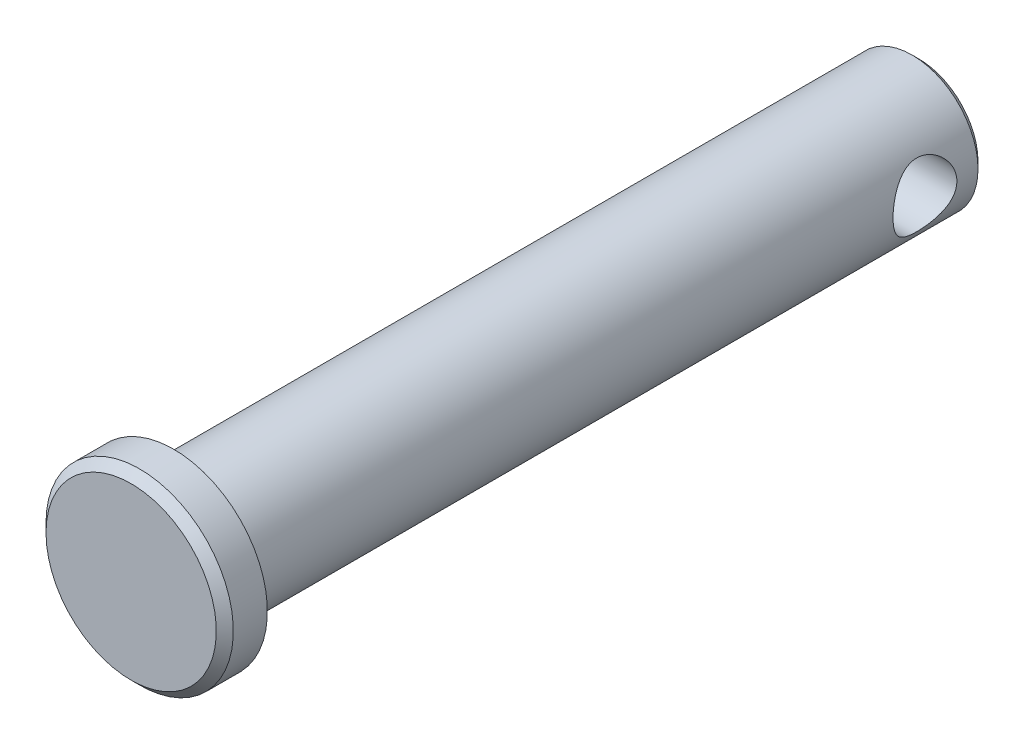
ISO-10303-21;
HEADER;
FILE_DESCRIPTION(('STEP AP214'),'2;1');
FILE_NAME('part.step','',(''),(''),'','','');
FILE_SCHEMA(('AUTOMOTIVE_DESIGN { 1 0 10303 214 1 1 1 1 }'));
ENDSEC;
DATA;
#1=APPLICATION_CONTEXT('core data for automotive mechanical design processes');
#2=APPLICATION_PROTOCOL_DEFINITION('international standard','automotive_design',2000,#1);
#3=PRODUCT_CONTEXT('',#1,'mechanical');
#4=PRODUCT('Part','Part','',(#3));
#5=PRODUCT_RELATED_PRODUCT_CATEGORY('part','',(#4));
#6=PRODUCT_DEFINITION_FORMATION('','',#4);
#7=PRODUCT_DEFINITION_CONTEXT('part definition',#1,'design');
#8=PRODUCT_DEFINITION('design','',#6,#7);
#9=PRODUCT_DEFINITION_SHAPE('','',#8);
#10=(LENGTH_UNIT() NAMED_UNIT(*) SI_UNIT(.MILLI.,.METRE.));
#11=(NAMED_UNIT(*) PLANE_ANGLE_UNIT() SI_UNIT($,.RADIAN.));
#12=(NAMED_UNIT(*) SI_UNIT($,.STERADIAN.) SOLID_ANGLE_UNIT());
#13=UNCERTAINTY_MEASURE_WITH_UNIT(LENGTH_MEASURE(1.E-05),#10,'distance_accuracy_value','');
#14=(GEOMETRIC_REPRESENTATION_CONTEXT(3) GLOBAL_UNCERTAINTY_ASSIGNED_CONTEXT((#13)) GLOBAL_UNIT_ASSIGNED_CONTEXT((#10,
#11,#12)) REPRESENTATION_CONTEXT('',''));
#15=CARTESIAN_POINT('',(0.,0.,0.));
#16=DIRECTION('',(0.,0.,1.));
#17=DIRECTION('',(1.,0.,0.));
#18=AXIS2_PLACEMENT_3D('',#15,#16,#17);
#19=CARTESIAN_POINT('',(0.,0.,24.765));
#20=DIRECTION('',(0.,0.,1.));
#21=DIRECTION('',(1.,0.,0.));
#22=AXIS2_PLACEMENT_3D('',#19,#20,#21);
#23=PLANE('',#22);
#24=CARTESIAN_POINT('',(0.,0.,24.7650000000021));
#25=DIRECTION('',(0.,0.,-1.));
#26=DIRECTION('',(-1.,0.,0.));
#27=AXIS2_PLACEMENT_3D('',#24,#25,#26);
#28=CIRCLE('',#27,5.08000000002085);
#29=CARTESIAN_POINT('',(-5.08000000002085,0.,24.7650000000021));
#30=VERTEX_POINT('',#29);
#31=EDGE_CURVE('E25',#30,#30,#28,.T.);
#32=ORIENTED_EDGE('',*,*,#31,.F.);
#33=EDGE_LOOP('',(#32));
#34=FACE_BOUND('',#33,.T.);
#35=ADVANCED_FACE('F22',(#34),#23,.T.);
#36=CARTESIAN_POINT('',(0.,0.,24.257000000091));
#37=DIRECTION('',(0.,0.,-1.));
#38=DIRECTION('',(-1.,0.,0.));
#39=AXIS2_PLACEMENT_3D('',#36,#37,#38);
#40=CONICAL_SURFACE('',#39,5.58799999993198,0.785398163397448);
#41=ORIENTED_EDGE('',*,*,#31,.T.);
#42=EDGE_LOOP('',(#41));
#43=FACE_BOUND('',#42,.T.);
#44=CARTESIAN_POINT('',(0.,0.,24.257));
#45=DIRECTION('',(0.,0.,-1.));
#46=DIRECTION('',(-1.,0.,0.));
#47=AXIS2_PLACEMENT_3D('',#44,#45,#46);
#48=CIRCLE('',#47,5.588);
#49=CARTESIAN_POINT('',(-5.588,0.,24.257));
#50=VERTEX_POINT('',#49);
#51=EDGE_CURVE('E47',#50,#50,#48,.T.);
#52=ORIENTED_EDGE('',*,*,#51,.F.);
#53=EDGE_LOOP('',(#52));
#54=FACE_BOUND('',#53,.T.);
#55=ADVANCED_FACE('F89',(#43,#54),#40,.T.);
#56=CARTESIAN_POINT('',(0.,0.,24.765));
#57=DIRECTION('',(0.,0.,-1.));
#58=DIRECTION('',(-1.,0.,0.));
#59=AXIS2_PLACEMENT_3D('',#56,#57,#58);
#60=CYLINDRICAL_SURFACE('',#59,5.588);
#61=ORIENTED_EDGE('',*,*,#51,.T.);
#62=EDGE_LOOP('',(#61));
#63=FACE_BOUND('',#62,.T.);
#64=CARTESIAN_POINT('',(0.,0.,22.225));
#65=DIRECTION('',(0.,0.,-1.));
#66=DIRECTION('',(-1.,0.,0.));
#67=AXIS2_PLACEMENT_3D('',#64,#65,#66);
#68=CIRCLE('',#67,5.588);
#69=CARTESIAN_POINT('',(-5.588,0.,22.225));
#70=VERTEX_POINT('',#69);
#71=EDGE_CURVE('E78',#70,#70,#68,.F.);
#72=ORIENTED_EDGE('',*,*,#71,.T.);
#73=EDGE_LOOP('',(#72));
#74=FACE_BOUND('',#73,.T.);
#75=ADVANCED_FACE('F96',(#63,#74),#60,.T.);
#76=CARTESIAN_POINT('',(0.,0.,-22.225));
#77=DIRECTION('',(0.,0.,1.));
#78=DIRECTION('',(1.,0.,0.));
#79=AXIS2_PLACEMENT_3D('',#76,#77,#78);
#80=PLANE('',#79);
#81=CARTESIAN_POINT('',(0.,0.,-22.2249999999917));
#82=DIRECTION('',(0.,0.,1.));
#83=DIRECTION('',(1.,0.,0.));
#84=AXIS2_PLACEMENT_3D('',#81,#82,#83);
#85=CIRCLE('',#84,3.53186999996069);
#86=CARTESIAN_POINT('',(3.53186999996069,0.,-22.2249999999917));
#87=VERTEX_POINT('',#86);
#88=EDGE_CURVE('E75',#87,#87,#85,.T.);
#89=ORIENTED_EDGE('',*,*,#88,.F.);
#90=EDGE_LOOP('',(#89));
#91=FACE_BOUND('',#90,.T.);
#92=ADVANCED_FACE('F100',(#91),#80,.F.);
#93=CARTESIAN_POINT('',(0.,0.,22.225));
#94=DIRECTION('',(0.,0.,1.));
#95=DIRECTION('',(1.,0.,0.));
#96=AXIS2_PLACEMENT_3D('',#93,#94,#95);
#97=PLANE('',#96);
#98=ORIENTED_EDGE('',*,*,#71,.F.);
#99=EDGE_LOOP('',(#98));
#100=FACE_BOUND('',#99,.T.);
#101=CARTESIAN_POINT('',(0.,0.,22.225));
#102=DIRECTION('',(0.,0.,-1.));
#103=DIRECTION('',(-1.,0.,0.));
#104=AXIS2_PLACEMENT_3D('',#101,#102,#103);
#105=CIRCLE('',#104,3.9243);
#106=CARTESIAN_POINT('',(-3.9243,0.,22.225));
#107=VERTEX_POINT('',#106);
#108=EDGE_CURVE('E73',#107,#107,#105,.T.);
#109=ORIENTED_EDGE('',*,*,#108,.F.);
#110=EDGE_LOOP('',(#109));
#111=FACE_BOUND('',#110,.T.);
#112=ADVANCED_FACE('F105',(#100,#111),#97,.F.);
#113=CARTESIAN_POINT('',(0.,0.,-21.832570000015));
#114=DIRECTION('',(0.,0.,1.));
#115=DIRECTION('',(1.,0.,0.));
#116=AXIS2_PLACEMENT_3D('',#113,#114,#115);
#117=CONICAL_SURFACE('',#116,3.92429999999422,0.785398163469873);
#118=CARTESIAN_POINT('',(0.,0.,-21.83257));
#119=DIRECTION('',(0.,0.,-1.));
#120=DIRECTION('',(-1.,0.,0.));
#121=AXIS2_PLACEMENT_3D('',#118,#119,#120);
#122=CIRCLE('',#121,3.9243);
#123=CARTESIAN_POINT('',(-3.9243,0.,-21.83257));
#124=VERTEX_POINT('',#123);
#125=EDGE_CURVE('E30',#124,#124,#122,.F.);
#126=ORIENTED_EDGE('',*,*,#125,.F.);
#127=EDGE_LOOP('',(#126));
#128=FACE_BOUND('',#127,.T.);
#129=ORIENTED_EDGE('',*,*,#88,.T.);
#130=EDGE_LOOP('',(#129));
#131=FACE_BOUND('',#130,.T.);
#132=ADVANCED_FACE('F64',(#128,#131),#117,.T.);
#133=CARTESIAN_POINT('',(-5.588,0.,-18.669));
#134=DIRECTION('',(1.,0.,0.));
#135=DIRECTION('',(0.,0.,-1.));
#136=AXIS2_PLACEMENT_3D('',#133,#134,#135);
#137=CYLINDRICAL_SURFACE('',#136,1.905);
#138=CARTESIAN_POINT('',(3.9243,0.,-20.574));
#139=CARTESIAN_POINT('',(3.92429536563109,-0.100584335974829,-20.5739946680779));
#140=CARTESIAN_POINT('',(3.92039402890045,-0.201230310135641,-20.5659932237658));
#141=CARTESIAN_POINT('',(3.90518183677525,-0.39950623478433,-20.5343485536885));
#142=CARTESIAN_POINT('',(3.89386299854148,-0.497132817078152,-20.5106884755675));
#143=CARTESIAN_POINT('',(3.86500502954331,-0.686289742951308,-20.4488596940996));
#144=CARTESIAN_POINT('',(3.84748727224581,-0.777839765922849,-20.410740811692));
#145=CARTESIAN_POINT('',(3.8078521242205,-0.95314281273583,-20.3213421740891));
#146=CARTESIAN_POINT('',(3.78573425912933,-1.03689503117681,-20.2700610614761));
#147=CARTESIAN_POINT('',(3.73745530838699,-1.19965669731222,-20.1524110825147));
#148=CARTESIAN_POINT('',(3.71113427603428,-1.27811084102049,-20.0853405975619));
#149=CARTESIAN_POINT('',(3.65796700961063,-1.42316075191727,-19.9395222187479));
#150=CARTESIAN_POINT('',(3.6311204365663,-1.48974856554055,-19.8607665570553));
#151=CARTESIAN_POINT('',(3.57772368622993,-1.6139767552182,-19.6869944059112));
#152=CARTESIAN_POINT('',(3.55133410246642,-1.67062736651559,-19.5912153112168));
#153=CARTESIAN_POINT('',(3.50449853546743,-1.76677684573332,-19.3900595621988));
#154=CARTESIAN_POINT('',(3.48404853033341,-1.80628732883054,-19.2846894660767));
#155=CARTESIAN_POINT('',(3.45320183728657,-1.86455473165811,-19.0736352976841));
#156=CARTESIAN_POINT('',(3.44228892940876,-1.88438648993204,-18.9683270457561));
#157=CARTESIAN_POINT('',(3.43035066451894,-1.90604184208311,-18.7553581892309));
#158=CARTESIAN_POINT('',(3.42931652887583,-1.9078814244873,-18.6476997583879));
#159=CARTESIAN_POINT('',(3.43683297751125,-1.894291555758,-18.4459291092597));
#160=CARTESIAN_POINT('',(3.44433144231032,-1.88075802691733,-18.3516407813914));
#161=CARTESIAN_POINT('',(3.46623657268144,-1.84007140869675,-18.1668909073699));
#162=CARTESIAN_POINT('',(3.4806452291913,-1.81291439406675,-18.0764304722736));
#163=CARTESIAN_POINT('',(3.51507406134726,-1.74523594343692,-17.8993392652997));
#164=CARTESIAN_POINT('',(3.53521725284567,-1.70441763982462,-17.8128469808758));
#165=CARTESIAN_POINT('',(3.57884350934135,-1.61079900902623,-17.6475378885952));
#166=CARTESIAN_POINT('',(3.60232798188494,-1.55799362655803,-17.5687243391728));
#167=CARTESIAN_POINT('',(3.65335932257068,-1.43459350622732,-17.4111732256991));
#168=CARTESIAN_POINT('',(3.68105779391882,-1.36263218058345,-17.3335515830275));
#169=CARTESIAN_POINT('',(3.73512991896394,-1.2065470233319,-17.1910131109213));
#170=CARTESIAN_POINT('',(3.76150273088281,-1.12241559209542,-17.12610428007));
#171=CARTESIAN_POINT('',(3.8112985188032,-0.939917490579675,-17.008319305737));
#172=CARTESIAN_POINT('',(3.8345513133014,-0.841101672049683,-16.9560622446721));
#173=CARTESIAN_POINT('',(3.87404331089877,-0.63473405841268,-16.8693875317563));
#174=CARTESIAN_POINT('',(3.89029598417956,-0.527199518900337,-16.834935592112));
#175=CARTESIAN_POINT('',(3.90936187014218,-0.348928405738588,-16.7949211341896));
#176=CARTESIAN_POINT('',(3.91493622025283,-0.279779800161764,-16.783352931244));
#177=CARTESIAN_POINT('',(3.92240676358096,-0.140430759474601,-16.7678907938009));
#178=CARTESIAN_POINT('',(3.92430323582793,-0.070230404564547,-16.7639962771236));
#179=CARTESIAN_POINT('',(3.92429536563109,0.100584335974829,-16.7640053319221));
#180=CARTESIAN_POINT('',(3.92039402890045,0.201230310135642,-16.7720067762342));
#181=CARTESIAN_POINT('',(3.90518183677525,0.399506234784331,-16.8036514463115));
#182=CARTESIAN_POINT('',(3.89386299854148,0.497132817078153,-16.8273115244325));
#183=CARTESIAN_POINT('',(3.86500502954331,0.686289742951309,-16.8891403059004));
#184=CARTESIAN_POINT('',(3.84748727224581,0.777839765922849,-16.927259188308));
#185=CARTESIAN_POINT('',(3.8078521242205,0.95314281273583,-17.0166578259109));
#186=CARTESIAN_POINT('',(3.78573425912933,1.03689503117681,-17.0679389385239));
#187=CARTESIAN_POINT('',(3.73745530838699,1.19965669731222,-17.1855889174853));
#188=CARTESIAN_POINT('',(3.71113427603428,1.27811084102049,-17.252659402438));
#189=CARTESIAN_POINT('',(3.65796700961063,1.42316075191727,-17.3984777812521));
#190=CARTESIAN_POINT('',(3.6311204365663,1.48974856554055,-17.4772334429447));
#191=CARTESIAN_POINT('',(3.57772368622993,1.6139767552182,-17.6510055940888));
#192=CARTESIAN_POINT('',(3.55133410246642,1.67062736651559,-17.7467846887832));
#193=CARTESIAN_POINT('',(3.50449853546743,1.76677684573332,-17.9479404378012));
#194=CARTESIAN_POINT('',(3.48404853033341,1.80628732883054,-18.0533105339233));
#195=CARTESIAN_POINT('',(3.45320183728657,1.86455473165811,-18.2643647023159));
#196=CARTESIAN_POINT('',(3.44228892940876,1.88438648993204,-18.3696729542439));
#197=CARTESIAN_POINT('',(3.43035066451894,1.90604184208311,-18.5826418107691));
#198=CARTESIAN_POINT('',(3.42931652887583,1.9078814244873,-18.6903002416121));
#199=CARTESIAN_POINT('',(3.43683297751124,1.894291555758,-18.8920708907403));
#200=CARTESIAN_POINT('',(3.44433144231032,1.88075802691733,-18.9863592186086));
#201=CARTESIAN_POINT('',(3.46623657268144,1.84007140869675,-19.1711090926301));
#202=CARTESIAN_POINT('',(3.4806452291913,1.81291439406675,-19.2615695277263));
#203=CARTESIAN_POINT('',(3.51507406134726,1.74523594343692,-19.4386607347003));
#204=CARTESIAN_POINT('',(3.53521725284568,1.70441763982461,-19.5251530191242));
#205=CARTESIAN_POINT('',(3.57884350934135,1.61079900902622,-19.6904621114048));
#206=CARTESIAN_POINT('',(3.60232798188495,1.55799362655803,-19.7692756608272));
#207=CARTESIAN_POINT('',(3.65335932257068,1.43459350622732,-19.9268267743009));
#208=CARTESIAN_POINT('',(3.68105779391883,1.36263218058345,-20.0044484169725));
#209=CARTESIAN_POINT('',(3.73512991896394,1.2065470233319,-20.1469868890787));
#210=CARTESIAN_POINT('',(3.76150273088281,1.12241559209542,-20.2118957199299));
#211=CARTESIAN_POINT('',(3.8112985188032,0.939917490579676,-20.329680694263));
#212=CARTESIAN_POINT('',(3.8345513133014,0.841101672049684,-20.3819377553279));
#213=CARTESIAN_POINT('',(3.87404331089877,0.634734058412681,-20.4686124682437));
#214=CARTESIAN_POINT('',(3.89029598417956,0.527199518900337,-20.503064407888));
#215=CARTESIAN_POINT('',(3.90936187014218,0.348928405738588,-20.5430788658104));
#216=CARTESIAN_POINT('',(3.91493622025283,0.279779800161765,-20.554647068756));
#217=CARTESIAN_POINT('',(3.92240676358096,0.140430759474601,-20.5701092061991));
#218=CARTESIAN_POINT('',(3.92430323582793,0.0702304045645474,-20.5740037228764));
#219=CARTESIAN_POINT('',(3.9243,0.,-20.574));
#220=B_SPLINE_CURVE_WITH_KNOTS('',3,(#138,#139,#140,#141,#142,#143,#144,#145,#146,#147,#148,
#149,#150,#151,#152,#153,#154,#155,#156,#157,#158,#159,#160,#161,#162,#163,#164,#165,#166,#167,
#168,#169,#170,#171,#172,#173,#174,#175,#176,#177,#178,#179,#180,#181,#182,#183,#184,#185,#186,
#187,#188,#189,#190,#191,#192,#193,#194,#195,#196,#197,#198,#199,#200,#201,#202,#203,#204,#205,
#206,#207,#208,#209,#210,#211,#212,#213,#214,#215,#216,#217,#218,#219),.UNSPECIFIED.,.T.,.F.,(4,
2,2,2,2,2,2,2,2,2,2,2,2,2,2,2,2,2,2,2,2,2,2,2,2,2,2,2,2,2,2,2,2,2,2,2,2,2,2,2,4),(0.,
0.301477814760057,0.60328061901044,0.904052806697109,1.20485602541988,1.52307420461299,
1.84150487804872,2.18286871006357,2.52400085077202,2.845261938336,3.1662375151969,
3.45155196265414,3.73694866324092,4.02900029350856,4.32117531958609,4.64797616367021,
4.9749819667731,5.31570724343041,5.65577390830238,5.86628894726905,6.07678801447106,
6.37826582923112,6.6800686334815,6.98084082116817,7.28164403989094,7.59986221908405,
7.91829289251978,8.25965672453463,8.60078886524307,8.92204995280706,9.24302552966796,
9.52833997712519,9.81373667771197,10.1057883079796,10.3979633340571,10.7247641781413,
11.0517699812442,11.3924952579015,11.7325619227734,11.9430769617401,12.1535760289421),.UNSPECIFIED.);
#221=CARTESIAN_POINT('',(3.9243,0.,-20.574));
#222=VERTEX_POINT('',#221);
#223=EDGE_CURVE('E12',#222,#222,#220,.T.);
#224=ORIENTED_EDGE('',*,*,#223,.F.);
#225=EDGE_LOOP('',(#224));
#226=FACE_BOUND('',#225,.T.);
#227=CARTESIAN_POINT('',(-3.9243,0.,-16.764));
#228=CARTESIAN_POINT('',(-3.92429536563109,-0.100584335974828,-16.7640053319221));
#229=CARTESIAN_POINT('',(-3.92039402890045,-0.201230310135641,-16.7720067762342));
#230=CARTESIAN_POINT('',(-3.90518183677525,-0.399506234784329,-16.8036514463115));
#231=CARTESIAN_POINT('',(-3.89386299854148,-0.497132817078151,-16.8273115244325));
#232=CARTESIAN_POINT('',(-3.86500502954331,-0.686289742951308,-16.8891403059004));
#233=CARTESIAN_POINT('',(-3.84748727224581,-0.777839765922849,-16.927259188308));
#234=CARTESIAN_POINT('',(-3.8078521242205,-0.95314281273583,-17.0166578259109));
#235=CARTESIAN_POINT('',(-3.78573425912933,-1.0368950311768,-17.0679389385239));
#236=CARTESIAN_POINT('',(-3.73745530838699,-1.19965669731222,-17.1855889174853));
#237=CARTESIAN_POINT('',(-3.71113427603428,-1.27811084102049,-17.252659402438));
#238=CARTESIAN_POINT('',(-3.65796700961063,-1.42316075191727,-17.3984777812521));
#239=CARTESIAN_POINT('',(-3.6311204365663,-1.48974856554055,-17.4772334429447));
#240=CARTESIAN_POINT('',(-3.57772368622993,-1.6139767552182,-17.6510055940888));
#241=CARTESIAN_POINT('',(-3.55133410246642,-1.67062736651559,-17.7467846887832));
#242=CARTESIAN_POINT('',(-3.50449853546743,-1.76677684573332,-17.9479404378012));
#243=CARTESIAN_POINT('',(-3.48404853033341,-1.80628732883054,-18.0533105339233));
#244=CARTESIAN_POINT('',(-3.45320183728657,-1.86455473165811,-18.2643647023159));
#245=CARTESIAN_POINT('',(-3.44228892940876,-1.88438648993204,-18.3696729542439));
#246=CARTESIAN_POINT('',(-3.43035066451894,-1.90604184208311,-18.5826418107691));
#247=CARTESIAN_POINT('',(-3.42931652887583,-1.9078814244873,-18.6903002416121));
#248=CARTESIAN_POINT('',(-3.43683297751125,-1.894291555758,-18.8920708907403));
#249=CARTESIAN_POINT('',(-3.44433144231032,-1.88075802691733,-18.9863592186086));
#250=CARTESIAN_POINT('',(-3.46623657268144,-1.84007140869675,-19.1711090926301));
#251=CARTESIAN_POINT('',(-3.4806452291913,-1.81291439406675,-19.2615695277263));
#252=CARTESIAN_POINT('',(-3.51507406134726,-1.74523594343692,-19.4386607347003));
#253=CARTESIAN_POINT('',(-3.53521725284567,-1.70441763982461,-19.5251530191242));
#254=CARTESIAN_POINT('',(-3.57884350934135,-1.61079900902622,-19.6904621114048));
#255=CARTESIAN_POINT('',(-3.60232798188494,-1.55799362655803,-19.7692756608272));
#256=CARTESIAN_POINT('',(-3.65335932257068,-1.43459350622732,-19.9268267743009));
#257=CARTESIAN_POINT('',(-3.68105779391882,-1.36263218058345,-20.0044484169725));
#258=CARTESIAN_POINT('',(-3.73512991896394,-1.2065470233319,-20.1469868890787));
#259=CARTESIAN_POINT('',(-3.76150273088281,-1.12241559209542,-20.2118957199299));
#260=CARTESIAN_POINT('',(-3.8112985188032,-0.939917490579676,-20.329680694263));
#261=CARTESIAN_POINT('',(-3.8345513133014,-0.841101672049684,-20.3819377553279));
#262=CARTESIAN_POINT('',(-3.87404331089877,-0.634734058412681,-20.4686124682437));
#263=CARTESIAN_POINT('',(-3.89029598417956,-0.527199518900339,-20.503064407888));
#264=CARTESIAN_POINT('',(-3.90936187014218,-0.34892840573859,-20.5430788658104));
#265=CARTESIAN_POINT('',(-3.91493622025283,-0.279779800161766,-20.554647068756));
#266=CARTESIAN_POINT('',(-3.92240676358096,-0.140430759474602,-20.5701092061991));
#267=CARTESIAN_POINT('',(-3.92430323582793,-0.0702304045645482,-20.5740037228764));
#268=CARTESIAN_POINT('',(-3.92429536563109,0.100584335974828,-20.5739946680779));
#269=CARTESIAN_POINT('',(-3.92039402890045,0.201230310135641,-20.5659932237658));
#270=CARTESIAN_POINT('',(-3.90518183677525,0.39950623478433,-20.5343485536885));
#271=CARTESIAN_POINT('',(-3.89386299854148,0.497132817078152,-20.5106884755675));
#272=CARTESIAN_POINT('',(-3.86500502954331,0.686289742951308,-20.4488596940996));
#273=CARTESIAN_POINT('',(-3.84748727224581,0.77783976592285,-20.410740811692));
#274=CARTESIAN_POINT('',(-3.8078521242205,0.953142812735831,-20.3213421740891));
#275=CARTESIAN_POINT('',(-3.78573425912933,1.03689503117681,-20.2700610614761));
#276=CARTESIAN_POINT('',(-3.73745530838699,1.19965669731222,-20.1524110825147));
#277=CARTESIAN_POINT('',(-3.71113427603428,1.27811084102049,-20.0853405975619));
#278=CARTESIAN_POINT('',(-3.65796700961063,1.42316075191727,-19.9395222187479));
#279=CARTESIAN_POINT('',(-3.6311204365663,1.48974856554055,-19.8607665570553));
#280=CARTESIAN_POINT('',(-3.57772368622993,1.6139767552182,-19.6869944059112));
#281=CARTESIAN_POINT('',(-3.55133410246642,1.67062736651559,-19.5912153112168));
#282=CARTESIAN_POINT('',(-3.50449853546743,1.76677684573332,-19.3900595621988));
#283=CARTESIAN_POINT('',(-3.48404853033341,1.80628732883054,-19.2846894660767));
#284=CARTESIAN_POINT('',(-3.45320183728657,1.86455473165811,-19.0736352976841));
#285=CARTESIAN_POINT('',(-3.44228892940876,1.88438648993204,-18.9683270457561));
#286=CARTESIAN_POINT('',(-3.43035066451894,1.90604184208311,-18.7553581892309));
#287=CARTESIAN_POINT('',(-3.42931652887583,1.9078814244873,-18.6476997583879));
#288=CARTESIAN_POINT('',(-3.43683297751124,1.894291555758,-18.4459291092597));
#289=CARTESIAN_POINT('',(-3.44433144231032,1.88075802691733,-18.3516407813914));
#290=CARTESIAN_POINT('',(-3.46623657268144,1.84007140869675,-18.1668909073699));
#291=CARTESIAN_POINT('',(-3.4806452291913,1.81291439406675,-18.0764304722736));
#292=CARTESIAN_POINT('',(-3.51507406134726,1.74523594343692,-17.8993392652997));
#293=CARTESIAN_POINT('',(-3.53521725284567,1.70441763982461,-17.8128469808758));
#294=CARTESIAN_POINT('',(-3.57884350934135,1.61079900902622,-17.6475378885951));
#295=CARTESIAN_POINT('',(-3.60232798188495,1.55799362655803,-17.5687243391728));
#296=CARTESIAN_POINT('',(-3.65335932257068,1.43459350622732,-17.4111732256991));
#297=CARTESIAN_POINT('',(-3.68105779391882,1.36263218058345,-17.3335515830275));
#298=CARTESIAN_POINT('',(-3.73512991896394,1.2065470233319,-17.1910131109213));
#299=CARTESIAN_POINT('',(-3.76150273088281,1.12241559209542,-17.12610428007));
#300=CARTESIAN_POINT('',(-3.8112985188032,0.939917490579676,-17.008319305737));
#301=CARTESIAN_POINT('',(-3.8345513133014,0.841101672049684,-16.9560622446721));
#302=CARTESIAN_POINT('',(-3.87404331089877,0.634734058412681,-16.8693875317563));
#303=CARTESIAN_POINT('',(-3.89029598417956,0.527199518900338,-16.834935592112));
#304=CARTESIAN_POINT('',(-3.90936187014218,0.348928405738588,-16.7949211341896));
#305=CARTESIAN_POINT('',(-3.91493622025283,0.279779800161765,-16.783352931244));
#306=CARTESIAN_POINT('',(-3.92240676358096,0.140430759474601,-16.7678907938009));
#307=CARTESIAN_POINT('',(-3.92430323582793,0.0702304045645479,-16.7639962771236));
#308=CARTESIAN_POINT('',(-3.9243,0.,-16.764));
#309=B_SPLINE_CURVE_WITH_KNOTS('',3,(#227,#228,#229,#230,#231,#232,#233,#234,#235,#236,#237,
#238,#239,#240,#241,#242,#243,#244,#245,#246,#247,#248,#249,#250,#251,#252,#253,#254,#255,#256,
#257,#258,#259,#260,#261,#262,#263,#264,#265,#266,#267,#268,#269,#270,#271,#272,#273,#274,#275,
#276,#277,#278,#279,#280,#281,#282,#283,#284,#285,#286,#287,#288,#289,#290,#291,#292,#293,#294,
#295,#296,#297,#298,#299,#300,#301,#302,#303,#304,#305,#306,#307,#308),.UNSPECIFIED.,.T.,.F.,(4,
2,2,2,2,2,2,2,2,2,2,2,2,2,2,2,2,2,2,2,2,2,2,2,2,2,2,2,2,2,2,2,2,2,2,2,2,2,2,2,4),(0.,
0.301477814760057,0.60328061901044,0.90405280669711,1.20485602541988,1.52307420461299,
1.84150487804872,2.18286871006357,2.52400085077201,2.845261938336,3.1662375151969,
3.45155196265414,3.73694866324091,4.02900029350856,4.32117531958609,4.64797616367021,
4.9749819667731,5.31570724343041,5.65577390830237,5.86628894726905,6.07678801447106,
6.37826582923111,6.6800686334815,6.98084082116817,7.28164403989094,7.59986221908405,
7.91829289251977,8.25965672453462,8.60078886524307,8.92204995280705,9.24302552966796,
9.52833997712519,9.81373667771197,10.1057883079796,10.3979633340571,10.7247641781413,
11.0517699812442,11.3924952579015,11.7325619227734,11.9430769617401,12.1535760289421),.UNSPECIFIED.);
#310=CARTESIAN_POINT('',(-3.9243,0.,-16.764));
#311=VERTEX_POINT('',#310);
#312=EDGE_CURVE('E38',#311,#311,#309,.T.);
#313=ORIENTED_EDGE('',*,*,#312,.F.);
#314=EDGE_LOOP('',(#313));
#315=FACE_BOUND('',#314,.T.);
#316=ADVANCED_FACE('F52',(#226,#315),#137,.F.);
#317=CARTESIAN_POINT('',(0.,0.,22.225));
#318=DIRECTION('',(0.,0.,-1.));
#319=DIRECTION('',(-1.,0.,0.));
#320=AXIS2_PLACEMENT_3D('',#317,#318,#319);
#321=CYLINDRICAL_SURFACE('',#320,3.9243);
#322=ORIENTED_EDGE('',*,*,#125,.T.);
#323=EDGE_LOOP('',(#322));
#324=FACE_BOUND('',#323,.T.);
#325=ORIENTED_EDGE('',*,*,#312,.T.);
#326=EDGE_LOOP('',(#325));
#327=FACE_BOUND('',#326,.T.);
#328=ORIENTED_EDGE('',*,*,#108,.T.);
#329=EDGE_LOOP('',(#328));
#330=FACE_BOUND('',#329,.T.);
#331=ORIENTED_EDGE('',*,*,#223,.T.);
#332=EDGE_LOOP('',(#331));
#333=FACE_BOUND('',#332,.T.);
#334=ADVANCED_FACE('F55',(#324,#327,#330,#333),#321,.T.);
#335=CLOSED_SHELL('',(#35,#55,#75,#92,#112,#132,#316,#334));
#336=MANIFOLD_SOLID_BREP('B1',#335);
#337=ADVANCED_BREP_SHAPE_REPRESENTATION('',(#18,#336),#14);
#338=SHAPE_DEFINITION_REPRESENTATION(#9,#337);
ENDSEC;
END-ISO-10303-21;
